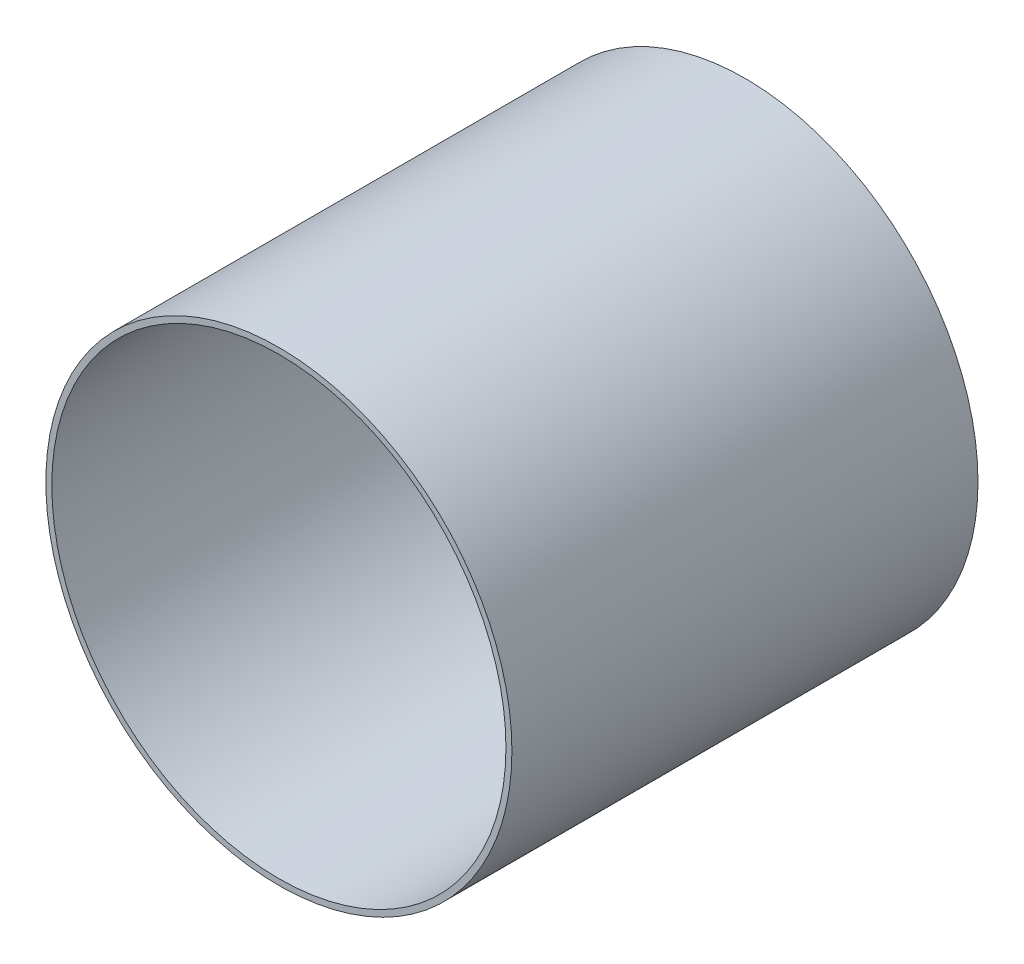
ISO-10303-21;
HEADER;
FILE_DESCRIPTION(('STEP AP214'),'2;1');
FILE_NAME('part.step','',(''),(''),'','','');
FILE_SCHEMA(('AUTOMOTIVE_DESIGN { 1 0 10303 214 1 1 1 1 }'));
ENDSEC;
DATA;
#1=APPLICATION_CONTEXT('core data for automotive mechanical design processes');
#2=APPLICATION_PROTOCOL_DEFINITION('international standard','automotive_design',2000,#1);
#3=PRODUCT_CONTEXT('',#1,'mechanical');
#4=PRODUCT('Part','Part','',(#3));
#5=PRODUCT_RELATED_PRODUCT_CATEGORY('part','',(#4));
#6=PRODUCT_DEFINITION_FORMATION('','',#4);
#7=PRODUCT_DEFINITION_CONTEXT('part definition',#1,'design');
#8=PRODUCT_DEFINITION('design','',#6,#7);
#9=PRODUCT_DEFINITION_SHAPE('','',#8);
#10=(LENGTH_UNIT() NAMED_UNIT(*) SI_UNIT(.MILLI.,.METRE.));
#11=(NAMED_UNIT(*) PLANE_ANGLE_UNIT() SI_UNIT($,.RADIAN.));
#12=(NAMED_UNIT(*) SI_UNIT($,.STERADIAN.) SOLID_ANGLE_UNIT());
#13=UNCERTAINTY_MEASURE_WITH_UNIT(LENGTH_MEASURE(1.E-05),#10,'distance_accuracy_value','');
#14=(GEOMETRIC_REPRESENTATION_CONTEXT(3) GLOBAL_UNCERTAINTY_ASSIGNED_CONTEXT((#13)) GLOBAL_UNIT_ASSIGNED_CONTEXT((#10,
#11,#12)) REPRESENTATION_CONTEXT('',''));
#15=CARTESIAN_POINT('',(0.,0.,0.));
#16=DIRECTION('',(0.,0.,1.));
#17=DIRECTION('',(1.,0.,0.));
#18=AXIS2_PLACEMENT_3D('',#15,#16,#17);
#19=CARTESIAN_POINT('',(0.,0.,312.));
#20=DIRECTION('',(0.,0.,-1.));
#21=DIRECTION('',(-1.,0.,0.));
#22=AXIS2_PLACEMENT_3D('',#19,#20,#21);
#23=CYLINDRICAL_SURFACE('',#22,156.);
#24=CARTESIAN_POINT('',(0.,0.,312.));
#25=DIRECTION('',(0.,0.,1.));
#26=DIRECTION('',(1.,0.,0.));
#27=AXIS2_PLACEMENT_3D('',#24,#25,#26);
#28=CIRCLE('',#27,156.);
#29=CARTESIAN_POINT('',(156.,0.,312.));
#30=VERTEX_POINT('',#29);
#31=EDGE_CURVE('E10',#30,#30,#28,.T.);
#32=ORIENTED_EDGE('',*,*,#31,.F.);
#33=EDGE_LOOP('',(#32));
#34=FACE_BOUND('',#33,.T.);
#35=CARTESIAN_POINT('',(0.,0.,0.));
#36=DIRECTION('',(0.,0.,1.));
#37=DIRECTION('',(1.,0.,0.));
#38=AXIS2_PLACEMENT_3D('',#35,#36,#37);
#39=CIRCLE('',#38,156.);
#40=CARTESIAN_POINT('',(156.,0.,0.));
#41=VERTEX_POINT('',#40);
#42=EDGE_CURVE('E38',#41,#41,#39,.T.);
#43=ORIENTED_EDGE('',*,*,#42,.T.);
#44=EDGE_LOOP('',(#43));
#45=FACE_BOUND('',#44,.T.);
#46=ADVANCED_FACE('F35',(#34,#45),#23,.T.);
#47=CARTESIAN_POINT('',(0.,0.,312.));
#48=DIRECTION('',(0.,0.,1.));
#49=DIRECTION('',(1.,0.,0.));
#50=AXIS2_PLACEMENT_3D('',#47,#48,#49);
#51=PLANE('',#50);
#52=CARTESIAN_POINT('',(0.,0.,312.));
#53=DIRECTION('',(0.,0.,1.));
#54=DIRECTION('',(1.,0.,0.));
#55=AXIS2_PLACEMENT_3D('',#52,#53,#54);
#56=CIRCLE('',#55,152.);
#57=CARTESIAN_POINT('',(152.,0.,312.));
#58=VERTEX_POINT('',#57);
#59=EDGE_CURVE('E47',#58,#58,#56,.T.);
#60=ORIENTED_EDGE('',*,*,#59,.F.);
#61=EDGE_LOOP('',(#60));
#62=FACE_BOUND('',#61,.T.);
#63=ORIENTED_EDGE('',*,*,#31,.T.);
#64=EDGE_LOOP('',(#63));
#65=FACE_BOUND('',#64,.T.);
#66=ADVANCED_FACE('F62',(#62,#65),#51,.T.);
#67=CARTESIAN_POINT('',(0.,0.,0.));
#68=DIRECTION('',(0.,0.,1.));
#69=DIRECTION('',(1.,0.,0.));
#70=AXIS2_PLACEMENT_3D('',#67,#68,#69);
#71=PLANE('',#70);
#72=CARTESIAN_POINT('',(0.,0.,0.));
#73=DIRECTION('',(0.,0.,1.));
#74=DIRECTION('',(1.,0.,0.));
#75=AXIS2_PLACEMENT_3D('',#72,#73,#74);
#76=CIRCLE('',#75,152.);
#77=CARTESIAN_POINT('',(152.,0.,0.));
#78=VERTEX_POINT('',#77);
#79=EDGE_CURVE('E45',#78,#78,#76,.T.);
#80=ORIENTED_EDGE('',*,*,#79,.T.);
#81=EDGE_LOOP('',(#80));
#82=FACE_BOUND('',#81,.T.);
#83=ORIENTED_EDGE('',*,*,#42,.F.);
#84=EDGE_LOOP('',(#83));
#85=FACE_BOUND('',#84,.T.);
#86=ADVANCED_FACE('F53',(#82,#85),#71,.F.);
#87=CARTESIAN_POINT('',(0.,0.,0.));
#88=DIRECTION('',(0.,0.,1.));
#89=DIRECTION('',(1.,0.,0.));
#90=AXIS2_PLACEMENT_3D('',#87,#88,#89);
#91=CYLINDRICAL_SURFACE('',#90,152.);
#92=ORIENTED_EDGE('',*,*,#79,.F.);
#93=EDGE_LOOP('',(#92));
#94=FACE_BOUND('',#93,.T.);
#95=ORIENTED_EDGE('',*,*,#59,.T.);
#96=EDGE_LOOP('',(#95));
#97=FACE_BOUND('',#96,.T.);
#98=ADVANCED_FACE('F56',(#94,#97),#91,.F.);
#99=CLOSED_SHELL('',(#46,#66,#86,#98));
#100=MANIFOLD_SOLID_BREP('B2',#99);
#101=ADVANCED_BREP_SHAPE_REPRESENTATION('',(#18,#100),#14);
#102=SHAPE_DEFINITION_REPRESENTATION(#9,#101);
ENDSEC;
END-ISO-10303-21;
